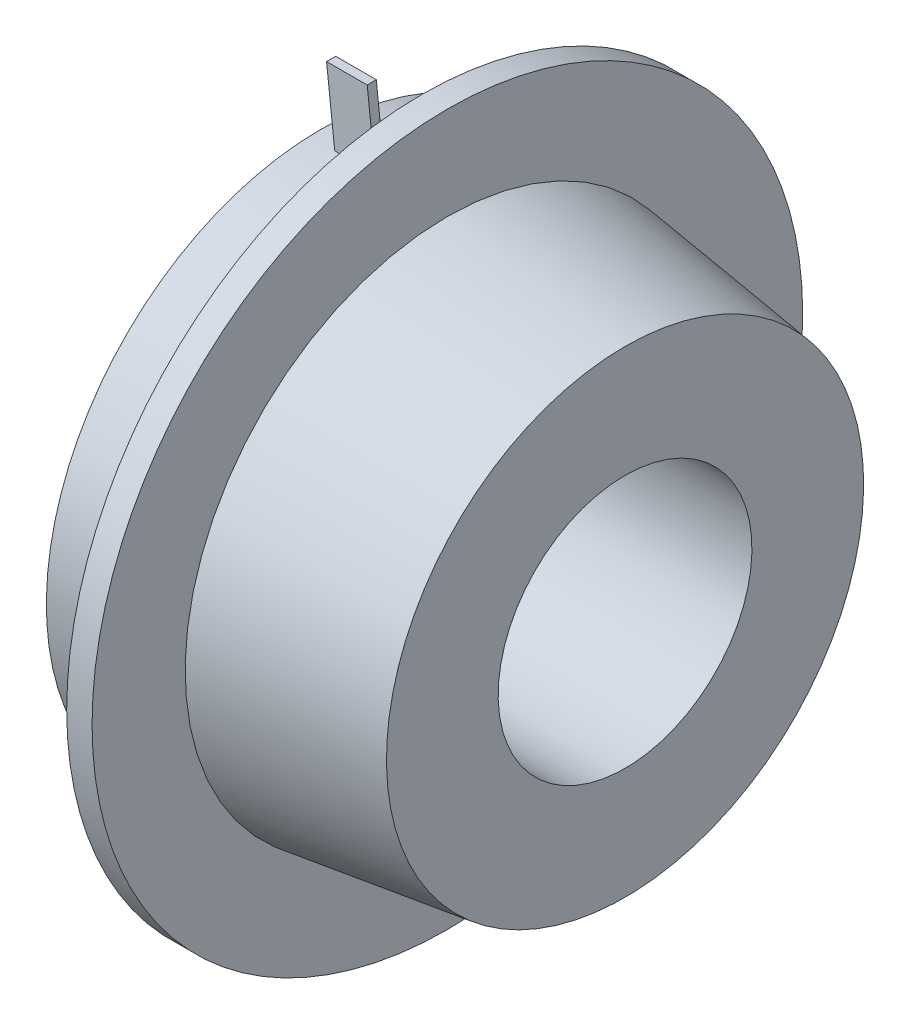
ISO-10303-21;
HEADER;
FILE_DESCRIPTION(('STEP AP214'),'2;1');
FILE_NAME('part.step','',(''),(''),'','','');
FILE_SCHEMA(('AUTOMOTIVE_DESIGN { 1 0 10303 214 1 1 1 1 }'));
ENDSEC;
DATA;
#1=APPLICATION_CONTEXT('core data for automotive mechanical design processes');
#2=APPLICATION_PROTOCOL_DEFINITION('international standard','automotive_design',2000,#1);
#3=PRODUCT_CONTEXT('',#1,'mechanical');
#4=PRODUCT('Part','Part','',(#3));
#5=PRODUCT_RELATED_PRODUCT_CATEGORY('part','',(#4));
#6=PRODUCT_DEFINITION_FORMATION('','',#4);
#7=PRODUCT_DEFINITION_CONTEXT('part definition',#1,'design');
#8=PRODUCT_DEFINITION('design','',#6,#7);
#9=PRODUCT_DEFINITION_SHAPE('','',#8);
#10=(LENGTH_UNIT() NAMED_UNIT(*) SI_UNIT(.MILLI.,.METRE.));
#11=(NAMED_UNIT(*) PLANE_ANGLE_UNIT() SI_UNIT($,.RADIAN.));
#12=(NAMED_UNIT(*) SI_UNIT($,.STERADIAN.) SOLID_ANGLE_UNIT());
#13=UNCERTAINTY_MEASURE_WITH_UNIT(LENGTH_MEASURE(1.E-05),#10,'distance_accuracy_value','');
#14=(GEOMETRIC_REPRESENTATION_CONTEXT(3) GLOBAL_UNCERTAINTY_ASSIGNED_CONTEXT((#13)) GLOBAL_UNIT_ASSIGNED_CONTEXT((#10,
#11,#12)) REPRESENTATION_CONTEXT('',''));
#15=CARTESIAN_POINT('',(0.,0.,0.));
#16=DIRECTION('',(0.,0.,1.));
#17=DIRECTION('',(1.,0.,0.));
#18=AXIS2_PLACEMENT_3D('',#15,#16,#17);
#19=CARTESIAN_POINT('',(0.,0.,0.));
#20=DIRECTION('',(-1.,0.,0.));
#21=DIRECTION('',(0.,0.,1.));
#22=AXIS2_PLACEMENT_3D('',#19,#20,#21);
#23=CYLINDRICAL_SURFACE('',#22,500.);
#24=CARTESIAN_POINT('',(1450.,0.,0.));
#25=DIRECTION('',(-1.,0.,0.));
#26=DIRECTION('',(0.,0.,1.));
#27=AXIS2_PLACEMENT_3D('',#24,#25,#26);
#28=CIRCLE('',#27,500.);
#29=CARTESIAN_POINT('',(1450.,500.,-3.58979302984161E-06));
#30=VERTEX_POINT('',#29);
#31=CARTESIAN_POINT('',(1450.,500.,0.));
#32=VERTEX_POINT('',#31);
#33=EDGE_CURVE('E12',#30,#32,#28,.T.);
#34=ORIENTED_EDGE('',*,*,#33,.T.);
#35=DIRECTION('',(1.,0.,0.));
#36=VECTOR('',#35,1.);
#37=CARTESIAN_POINT('',(1500.,500.,0.));
#38=LINE('',#37,#36);
#39=CARTESIAN_POINT('',(1500.,500.,0.));
#40=VERTEX_POINT('',#39);
#41=EDGE_CURVE('E108',#32,#40,#38,.T.);
#42=ORIENTED_EDGE('',*,*,#41,.T.);
#43=CARTESIAN_POINT('',(1500.,0.,0.));
#44=DIRECTION('',(-1.,0.,0.));
#45=DIRECTION('',(0.,0.,1.));
#46=AXIS2_PLACEMENT_3D('',#43,#44,#45);
#47=CIRCLE('',#46,500.);
#48=CARTESIAN_POINT('',(1500.,500.,-3.58979302984161E-06));
#49=VERTEX_POINT('',#48);
#50=EDGE_CURVE('E89',#49,#40,#47,.T.);
#51=ORIENTED_EDGE('',*,*,#50,.F.);
#52=DIRECTION('',(1.,0.,0.));
#53=VECTOR('',#52,1.);
#54=CARTESIAN_POINT('',(1500.,500.,-3.58979302984161E-06));
#55=LINE('',#54,#53);
#56=EDGE_CURVE('E117',#30,#49,#55,.T.);
#57=ORIENTED_EDGE('',*,*,#56,.F.);
#58=EDGE_LOOP('',(#34,#42,#51,#57));
#59=FACE_BOUND('',#58,.T.);
#60=ADVANCED_FACE('F49',(#59),#23,.F.);
#61=CARTESIAN_POINT('',(1450.,500.,-3.58979302984161E-06));
#62=DIRECTION('',(1.,0.,0.));
#63=DIRECTION('',(0.,0.,-1.));
#64=AXIS2_PLACEMENT_3D('',#61,#62,#63);
#65=PLANE('',#64);
#66=CARTESIAN_POINT('',(1450.,0.,0.));
#67=DIRECTION('',(-1.,0.,0.));
#68=DIRECTION('',(0.,0.,1.));
#69=AXIS2_PLACEMENT_3D('',#66,#67,#68);
#70=CIRCLE('',#69,700.);
#71=CARTESIAN_POINT('',(1450.,700.,-5.02571024177826E-06));
#72=VERTEX_POINT('',#71);
#73=CARTESIAN_POINT('',(1450.,700.,0.));
#74=VERTEX_POINT('',#73);
#75=EDGE_CURVE('E59',#72,#74,#70,.T.);
#76=ORIENTED_EDGE('',*,*,#75,.T.);
#77=DIRECTION('',(0.,-1.,0.));
#78=VECTOR('',#77,1.);
#79=CARTESIAN_POINT('',(1450.,500.,0.));
#80=LINE('',#79,#78);
#81=EDGE_CURVE('E114',#74,#32,#80,.T.);
#82=ORIENTED_EDGE('',*,*,#81,.T.);
#83=ORIENTED_EDGE('',*,*,#33,.F.);
#84=DIRECTION('',(0.,-1.,7.17958605968322E-09));
#85=VECTOR('',#84,1.);
#86=CARTESIAN_POINT('',(1450.,500.,-3.58979302984161E-06));
#87=LINE('',#86,#85);
#88=EDGE_CURVE('E105',#72,#30,#87,.T.);
#89=ORIENTED_EDGE('',*,*,#88,.F.);
#90=EDGE_LOOP('',(#76,#82,#83,#89));
#91=FACE_BOUND('',#90,.T.);
#92=ADVANCED_FACE('F55',(#91),#65,.F.);
#93=CARTESIAN_POINT('',(0.,0.,0.));
#94=DIRECTION('',(-1.,0.,0.));
#95=DIRECTION('',(0.,0.,1.));
#96=AXIS2_PLACEMENT_3D('',#93,#94,#95);
#97=CYLINDRICAL_SURFACE('',#96,700.);
#98=CARTESIAN_POINT('',(1500.,0.,0.));
#99=DIRECTION('',(-1.,0.,0.));
#100=DIRECTION('',(0.,0.,1.));
#101=AXIS2_PLACEMENT_3D('',#98,#99,#100);
#102=CIRCLE('',#101,700.);
#103=CARTESIAN_POINT('',(1500.,700.,-5.02571024177826E-06));
#104=VERTEX_POINT('',#103);
#105=CARTESIAN_POINT('',(1500.,700.,0.));
#106=VERTEX_POINT('',#105);
#107=EDGE_CURVE('E102',#104,#106,#102,.T.);
#108=ORIENTED_EDGE('',*,*,#107,.T.);
#109=DIRECTION('',(-1.,0.,0.));
#110=VECTOR('',#109,1.);
#111=CARTESIAN_POINT('',(1450.,700.,0.));
#112=LINE('',#111,#110);
#113=EDGE_CURVE('E109',#106,#74,#112,.T.);
#114=ORIENTED_EDGE('',*,*,#113,.T.);
#115=ORIENTED_EDGE('',*,*,#75,.F.);
#116=DIRECTION('',(-1.,0.,0.));
#117=VECTOR('',#116,1.);
#118=CARTESIAN_POINT('',(1450.,700.,-5.02571024177826E-06));
#119=LINE('',#118,#117);
#120=EDGE_CURVE('E119',#104,#72,#119,.T.);
#121=ORIENTED_EDGE('',*,*,#120,.F.);
#122=EDGE_LOOP('',(#108,#114,#115,#121));
#123=FACE_BOUND('',#122,.T.);
#124=ADVANCED_FACE('F122',(#123),#97,.T.);
#125=CARTESIAN_POINT('',(1500.,700.,-5.02571024177826E-06));
#126=DIRECTION('',(-1.,0.,0.));
#127=DIRECTION('',(0.,0.,1.));
#128=AXIS2_PLACEMENT_3D('',#125,#126,#127);
#129=PLANE('',#128);
#130=DIRECTION('',(0.,1.,-7.17958605968322E-09));
#131=VECTOR('',#130,1.);
#132=CARTESIAN_POINT('',(1500.,700.,-5.02571024177826E-06));
#133=LINE('',#132,#131);
#134=EDGE_CURVE('E96',#49,#104,#133,.T.);
#135=ORIENTED_EDGE('',*,*,#134,.F.);
#136=ORIENTED_EDGE('',*,*,#50,.T.);
#137=DIRECTION('',(0.,1.,0.));
#138=VECTOR('',#137,1.);
#139=CARTESIAN_POINT('',(1500.,700.,0.));
#140=LINE('',#139,#138);
#141=EDGE_CURVE('E93',#40,#106,#140,.T.);
#142=ORIENTED_EDGE('',*,*,#141,.T.);
#143=ORIENTED_EDGE('',*,*,#107,.F.);
#144=EDGE_LOOP('',(#135,#136,#142,#143));
#145=FACE_BOUND('',#144,.T.);
#146=ADVANCED_FACE('F95',(#145),#129,.F.);
#147=CARTESIAN_POINT('',(0.,0.,0.));
#148=DIRECTION('',(0.,-7.17958605968322E-09,-1.));
#149=DIRECTION('',(-1.,0.,0.));
#150=AXIS2_PLACEMENT_3D('',#147,#148,#149);
#151=PLANE('',#150);
#152=ORIENTED_EDGE('',*,*,#56,.T.);
#153=ORIENTED_EDGE('',*,*,#134,.T.);
#154=ORIENTED_EDGE('',*,*,#120,.T.);
#155=ORIENTED_EDGE('',*,*,#88,.T.);
#156=EDGE_LOOP('',(#152,#153,#154,#155));
#157=FACE_BOUND('',#156,.T.);
#158=ADVANCED_FACE('F125',(#157),#151,.F.);
#159=CARTESIAN_POINT('',(0.,0.,0.));
#160=DIRECTION('',(0.,0.,-1.));
#161=DIRECTION('',(-1.,0.,0.));
#162=AXIS2_PLACEMENT_3D('',#159,#160,#161);
#163=PLANE('',#162);
#164=ORIENTED_EDGE('',*,*,#41,.F.);
#165=ORIENTED_EDGE('',*,*,#81,.F.);
#166=ORIENTED_EDGE('',*,*,#113,.F.);
#167=ORIENTED_EDGE('',*,*,#141,.F.);
#168=EDGE_LOOP('',(#164,#165,#166,#167));
#169=FACE_BOUND('',#168,.T.);
#170=ADVANCED_FACE('F107',(#169),#163,.T.);
#171=CLOSED_SHELL('',(#60,#92,#124,#146,#158,#170));
#172=MANIFOLD_SOLID_BREP('B2',#171);
#173=CARTESIAN_POINT('',(1380.,500.,18.));
#174=DIRECTION('',(0.,1.,0.));
#175=DIRECTION('',(0.,0.,1.));
#176=AXIS2_PLACEMENT_3D('',#173,#174,#175);
#177=PLANE('',#176);
#178=DIRECTION('',(1.,0.,0.));
#179=VECTOR('',#178,1.);
#180=CARTESIAN_POINT('',(1380.,500.,0.));
#181=LINE('',#180,#179);
#182=CARTESIAN_POINT('',(1300.,500.,0.));
#183=VERTEX_POINT('',#182);
#184=CARTESIAN_POINT('',(1380.,500.,0.));
#185=VERTEX_POINT('',#184);
#186=EDGE_CURVE('E237',#183,#185,#181,.T.);
#187=ORIENTED_EDGE('',*,*,#186,.T.);
#188=DIRECTION('',(0.,0.,-1.));
#189=VECTOR('',#188,1.);
#190=CARTESIAN_POINT('',(1380.,500.,18.));
#191=LINE('',#190,#189);
#192=CARTESIAN_POINT('',(1380.,500.,18.));
#193=VERTEX_POINT('',#192);
#194=EDGE_CURVE('E48',#193,#185,#191,.T.);
#195=ORIENTED_EDGE('',*,*,#194,.F.);
#196=DIRECTION('',(1.,0.,0.));
#197=VECTOR('',#196,1.);
#198=CARTESIAN_POINT('',(1380.,500.,18.));
#199=LINE('',#198,#197);
#200=CARTESIAN_POINT('',(1300.,500.,18.));
#201=VERTEX_POINT('',#200);
#202=EDGE_CURVE('E222',#201,#193,#199,.T.);
#203=ORIENTED_EDGE('',*,*,#202,.F.);
#204=DIRECTION('',(0.,0.,-1.));
#205=VECTOR('',#204,1.);
#206=CARTESIAN_POINT('',(1300.,500.,18.));
#207=LINE('',#206,#205);
#208=EDGE_CURVE('E235',#201,#183,#207,.T.);
#209=ORIENTED_EDGE('',*,*,#208,.T.);
#210=EDGE_LOOP('',(#187,#195,#203,#209));
#211=FACE_BOUND('',#210,.T.);
#212=ADVANCED_FACE('F171',(#211),#177,.F.);
#213=CARTESIAN_POINT('',(1360.,680.,18.));
#214=DIRECTION('',(-0.993883734673619,-0.110431526074845,0.));
#215=DIRECTION('',(0.110431526074845,-0.993883734673619,0.));
#216=AXIS2_PLACEMENT_3D('',#213,#214,#215);
#217=PLANE('',#216);
#218=DIRECTION('',(-0.110431526074845,0.993883734673619,0.));
#219=VECTOR('',#218,1.);
#220=CARTESIAN_POINT('',(1360.,680.,0.));
#221=LINE('',#220,#219);
#222=CARTESIAN_POINT('',(1360.,680.,0.));
#223=VERTEX_POINT('',#222);
#224=EDGE_CURVE('E228',#185,#223,#221,.T.);
#225=ORIENTED_EDGE('',*,*,#224,.T.);
#226=DIRECTION('',(0.,0.,-1.));
#227=VECTOR('',#226,1.);
#228=CARTESIAN_POINT('',(1360.,680.,18.));
#229=LINE('',#228,#227);
#230=CARTESIAN_POINT('',(1360.,680.,18.));
#231=VERTEX_POINT('',#230);
#232=EDGE_CURVE('E181',#231,#223,#229,.T.);
#233=ORIENTED_EDGE('',*,*,#232,.F.);
#234=DIRECTION('',(-0.110431526074845,0.993883734673619,0.));
#235=VECTOR('',#234,1.);
#236=CARTESIAN_POINT('',(1360.,680.,18.));
#237=LINE('',#236,#235);
#238=EDGE_CURVE('E219',#193,#231,#237,.T.);
#239=ORIENTED_EDGE('',*,*,#238,.F.);
#240=ORIENTED_EDGE('',*,*,#194,.T.);
#241=EDGE_LOOP('',(#225,#233,#239,#240));
#242=FACE_BOUND('',#241,.T.);
#243=ADVANCED_FACE('F230',(#242),#217,.F.);
#244=CARTESIAN_POINT('',(1280.,680.,18.));
#245=DIRECTION('',(0.,-1.,0.));
#246=DIRECTION('',(0.,0.,-1.));
#247=AXIS2_PLACEMENT_3D('',#244,#245,#246);
#248=PLANE('',#247);
#249=DIRECTION('',(-1.,0.,0.));
#250=VECTOR('',#249,1.);
#251=CARTESIAN_POINT('',(1280.,680.,0.));
#252=LINE('',#251,#250);
#253=CARTESIAN_POINT('',(1280.,680.,0.));
#254=VERTEX_POINT('',#253);
#255=EDGE_CURVE('E207',#223,#254,#252,.T.);
#256=ORIENTED_EDGE('',*,*,#255,.T.);
#257=DIRECTION('',(0.,0.,-1.));
#258=VECTOR('',#257,1.);
#259=CARTESIAN_POINT('',(1280.,680.,18.));
#260=LINE('',#259,#258);
#261=CARTESIAN_POINT('',(1280.,680.,18.));
#262=VERTEX_POINT('',#261);
#263=EDGE_CURVE('E227',#262,#254,#260,.T.);
#264=ORIENTED_EDGE('',*,*,#263,.F.);
#265=DIRECTION('',(-1.,0.,0.));
#266=VECTOR('',#265,1.);
#267=CARTESIAN_POINT('',(1280.,680.,18.));
#268=LINE('',#267,#266);
#269=EDGE_CURVE('E225',#231,#262,#268,.T.);
#270=ORIENTED_EDGE('',*,*,#269,.F.);
#271=ORIENTED_EDGE('',*,*,#232,.T.);
#272=EDGE_LOOP('',(#256,#264,#270,#271));
#273=FACE_BOUND('',#272,.T.);
#274=ADVANCED_FACE('F229',(#273),#248,.F.);
#275=CARTESIAN_POINT('',(1300.,500.,18.));
#276=DIRECTION('',(0.993883734673619,0.110431526074847,0.));
#277=DIRECTION('',(-0.110431526074847,0.993883734673619,0.));
#278=AXIS2_PLACEMENT_3D('',#275,#276,#277);
#279=PLANE('',#278);
#280=DIRECTION('',(0.110431526074847,-0.993883734673619,0.));
#281=VECTOR('',#280,1.);
#282=CARTESIAN_POINT('',(1300.,500.,0.));
#283=LINE('',#282,#281);
#284=EDGE_CURVE('E212',#254,#183,#283,.T.);
#285=ORIENTED_EDGE('',*,*,#284,.T.);
#286=ORIENTED_EDGE('',*,*,#208,.F.);
#287=DIRECTION('',(0.110431526074847,-0.993883734673619,0.));
#288=VECTOR('',#287,1.);
#289=CARTESIAN_POINT('',(1300.,500.,18.));
#290=LINE('',#289,#288);
#291=EDGE_CURVE('E188',#262,#201,#290,.T.);
#292=ORIENTED_EDGE('',*,*,#291,.F.);
#293=ORIENTED_EDGE('',*,*,#263,.T.);
#294=EDGE_LOOP('',(#285,#286,#292,#293));
#295=FACE_BOUND('',#294,.T.);
#296=ADVANCED_FACE('F243',(#295),#279,.F.);
#297=CARTESIAN_POINT('',(0.,0.,18.));
#298=DIRECTION('',(0.,0.,-1.));
#299=DIRECTION('',(-1.,0.,0.));
#300=AXIS2_PLACEMENT_3D('',#297,#298,#299);
#301=PLANE('',#300);
#302=ORIENTED_EDGE('',*,*,#202,.T.);
#303=ORIENTED_EDGE('',*,*,#238,.T.);
#304=ORIENTED_EDGE('',*,*,#269,.T.);
#305=ORIENTED_EDGE('',*,*,#291,.T.);
#306=EDGE_LOOP('',(#302,#303,#304,#305));
#307=FACE_BOUND('',#306,.T.);
#308=ADVANCED_FACE('F217',(#307),#301,.F.);
#309=CARTESIAN_POINT('',(0.,0.,0.));
#310=DIRECTION('',(0.,0.,-1.));
#311=DIRECTION('',(-1.,0.,0.));
#312=AXIS2_PLACEMENT_3D('',#309,#310,#311);
#313=PLANE('',#312);
#314=ORIENTED_EDGE('',*,*,#186,.F.);
#315=ORIENTED_EDGE('',*,*,#284,.F.);
#316=ORIENTED_EDGE('',*,*,#255,.F.);
#317=ORIENTED_EDGE('',*,*,#224,.F.);
#318=EDGE_LOOP('',(#314,#315,#316,#317));
#319=FACE_BOUND('',#318,.T.);
#320=ADVANCED_FACE('F247',(#319),#313,.T.);
#321=CLOSED_SHELL('',(#212,#243,#274,#296,#308,#320));
#322=MANIFOLD_SOLID_BREP('B6',#321);
#323=CARTESIAN_POINT('',(0.,0.,0.));
#324=DIRECTION('',(-1.,0.,0.));
#325=DIRECTION('',(0.,0.,1.));
#326=AXIS2_PLACEMENT_3D('',#323,#324,#325);
#327=CYLINDRICAL_SURFACE('',#326,250.);
#328=CARTESIAN_POINT('',(1250.,0.,0.));
#329=DIRECTION('',(-1.,0.,0.));
#330=DIRECTION('',(0.,0.,1.));
#331=AXIS2_PLACEMENT_3D('',#328,#329,#330);
#332=CIRCLE('',#331,250.);
#333=CARTESIAN_POINT('',(1250.,250.,-1.79489651492081E-06));
#334=VERTEX_POINT('',#333);
#335=CARTESIAN_POINT('',(1250.,250.,0.));
#336=VERTEX_POINT('',#335);
#337=EDGE_CURVE('E173',#334,#336,#332,.T.);
#338=ORIENTED_EDGE('',*,*,#337,.T.);
#339=DIRECTION('',(1.,0.,0.));
#340=VECTOR('',#339,1.);
#341=CARTESIAN_POINT('',(1850.,250.,0.));
#342=LINE('',#341,#340);
#343=CARTESIAN_POINT('',(1850.,250.,0.));
#344=VERTEX_POINT('',#343);
#345=EDGE_CURVE('E361',#336,#344,#342,.T.);
#346=ORIENTED_EDGE('',*,*,#345,.T.);
#347=CARTESIAN_POINT('',(1850.,0.,0.));
#348=DIRECTION('',(-1.,0.,0.));
#349=DIRECTION('',(0.,0.,1.));
#350=AXIS2_PLACEMENT_3D('',#347,#348,#349);
#351=CIRCLE('',#350,250.);
#352=CARTESIAN_POINT('',(1850.,250.,-1.79489651492081E-06));
#353=VERTEX_POINT('',#352);
#354=EDGE_CURVE('E343',#353,#344,#351,.T.);
#355=ORIENTED_EDGE('',*,*,#354,.F.);
#356=DIRECTION('',(1.,0.,0.));
#357=VECTOR('',#356,1.);
#358=CARTESIAN_POINT('',(1850.,250.,-1.79489651492081E-06));
#359=LINE('',#358,#357);
#360=EDGE_CURVE('E375',#334,#353,#359,.T.);
#361=ORIENTED_EDGE('',*,*,#360,.F.);
#362=EDGE_LOOP('',(#338,#346,#355,#361));
#363=FACE_BOUND('',#362,.T.);
#364=ADVANCED_FACE('F300',(#363),#327,.F.);
#365=CARTESIAN_POINT('',(1250.,250.,-1.79489651492081E-06));
#366=DIRECTION('',(1.,0.,0.));
#367=DIRECTION('',(0.,0.,-1.));
#368=AXIS2_PLACEMENT_3D('',#365,#366,#367);
#369=PLANE('',#368);
#370=CARTESIAN_POINT('',(1250.,0.,0.));
#371=DIRECTION('',(-1.,0.,0.));
#372=DIRECTION('',(0.,0.,1.));
#373=AXIS2_PLACEMENT_3D('',#370,#371,#372);
#374=CIRCLE('',#373,540.);
#375=CARTESIAN_POINT('',(1250.,540.,-3.87697647222894E-06));
#376=VERTEX_POINT('',#375);
#377=CARTESIAN_POINT('',(1250.,540.,0.));
#378=VERTEX_POINT('',#377);
#379=EDGE_CURVE('E304',#376,#378,#374,.T.);
#380=ORIENTED_EDGE('',*,*,#379,.T.);
#381=DIRECTION('',(0.,-1.,0.));
#382=VECTOR('',#381,1.);
#383=CARTESIAN_POINT('',(1250.,250.,0.));
#384=LINE('',#383,#382);
#385=EDGE_CURVE('E369',#378,#336,#384,.T.);
#386=ORIENTED_EDGE('',*,*,#385,.T.);
#387=ORIENTED_EDGE('',*,*,#337,.F.);
#388=DIRECTION('',(0.,-1.,7.17958605968322E-09));
#389=VECTOR('',#388,1.);
#390=CARTESIAN_POINT('',(1250.,250.,-1.79489651492081E-06));
#391=LINE('',#390,#389);
#392=EDGE_CURVE('E352',#376,#334,#391,.T.);
#393=ORIENTED_EDGE('',*,*,#392,.F.);
#394=EDGE_LOOP('',(#380,#386,#387,#393));
#395=FACE_BOUND('',#394,.T.);
#396=ADVANCED_FACE('F299',(#395),#369,.F.);
#397=CARTESIAN_POINT('',(1400.,0.,0.));
#398=DIRECTION('',(-1.,0.,0.));
#399=DIRECTION('',(0.,0.,1.));
#400=AXIS2_PLACEMENT_3D('',#397,#398,#399);
#401=CONICAL_SURFACE('',#400,530.,0.0665681637758239);
#402=CARTESIAN_POINT('',(1400.,0.,0.));
#403=DIRECTION('',(-1.,0.,0.));
#404=DIRECTION('',(0.,0.,1.));
#405=AXIS2_PLACEMENT_3D('',#402,#403,#404);
#406=CIRCLE('',#405,530.);
#407=CARTESIAN_POINT('',(1400.,530.,-3.80518061163211E-06));
#408=VERTEX_POINT('',#407);
#409=CARTESIAN_POINT('',(1400.,530.,0.));
#410=VERTEX_POINT('',#409);
#411=EDGE_CURVE('E382',#408,#410,#406,.T.);
#412=ORIENTED_EDGE('',*,*,#411,.T.);
#413=DIRECTION('',(-0.997785157856609,0.066519010523774,0.));
#414=VECTOR('',#413,1.);
#415=CARTESIAN_POINT('',(1250.,540.,0.));
#416=LINE('',#415,#414);
#417=EDGE_CURVE('E367',#410,#378,#416,.T.);
#418=ORIENTED_EDGE('',*,*,#417,.T.);
#419=ORIENTED_EDGE('',*,*,#379,.F.);
#420=DIRECTION('',(-0.997785157856609,0.066519010523774,-4.7757896066041E-10));
#421=VECTOR('',#420,1.);
#422=CARTESIAN_POINT('',(1250.,540.,-3.87697647222894E-06));
#423=LINE('',#422,#421);
#424=EDGE_CURVE('E380',#408,#376,#423,.T.);
#425=ORIENTED_EDGE('',*,*,#424,.F.);
#426=EDGE_LOOP('',(#412,#418,#419,#425));
#427=FACE_BOUND('',#426,.T.);
#428=ADVANCED_FACE('F381',(#427),#401,.T.);
#429=CARTESIAN_POINT('',(1850.,0.,0.));
#430=DIRECTION('',(-1.,0.,0.));
#431=DIRECTION('',(0.,0.,1.));
#432=AXIS2_PLACEMENT_3D('',#429,#430,#431);
#433=CONICAL_SURFACE('',#432,470.,0.132551532296674);
#434=CARTESIAN_POINT('',(1850.,0.,0.));
#435=DIRECTION('',(-1.,0.,0.));
#436=DIRECTION('',(0.,0.,1.));
#437=AXIS2_PLACEMENT_3D('',#434,#435,#436);
#438=CIRCLE('',#437,470.);
#439=CARTESIAN_POINT('',(1850.,470.,-3.37440544805111E-06));
#440=VERTEX_POINT('',#439);
#441=CARTESIAN_POINT('',(1850.,470.,0.));
#442=VERTEX_POINT('',#441);
#443=EDGE_CURVE('E354',#440,#442,#438,.T.);
#444=ORIENTED_EDGE('',*,*,#443,.T.);
#445=DIRECTION('',(-0.991227900682635,0.132163720091018,0.));
#446=VECTOR('',#445,1.);
#447=CARTESIAN_POINT('',(1700.,490.,0.));
#448=LINE('',#447,#446);
#449=EDGE_CURVE('E363',#442,#410,#448,.T.);
#450=ORIENTED_EDGE('',*,*,#449,.T.);
#451=ORIENTED_EDGE('',*,*,#411,.F.);
#452=DIRECTION('',(-0.991227900682635,0.132163720091018,-9.48880802361348E-10));
#453=VECTOR('',#452,1.);
#454=CARTESIAN_POINT('',(1700.,490.,-3.51799716924478E-06));
#455=LINE('',#454,#453);
#456=EDGE_CURVE('E373',#440,#408,#455,.T.);
#457=ORIENTED_EDGE('',*,*,#456,.F.);
#458=EDGE_LOOP('',(#444,#450,#451,#457));
#459=FACE_BOUND('',#458,.T.);
#460=ADVANCED_FACE('F390',(#459),#433,.T.);
#461=CARTESIAN_POINT('',(1850.,470.,-3.37440544805111E-06));
#462=DIRECTION('',(-1.,0.,0.));
#463=DIRECTION('',(0.,0.,1.));
#464=AXIS2_PLACEMENT_3D('',#461,#462,#463);
#465=PLANE('',#464);
#466=DIRECTION('',(0.,1.,-7.17958605968322E-09));
#467=VECTOR('',#466,1.);
#468=CARTESIAN_POINT('',(1850.,470.,-3.37440544805111E-06));
#469=LINE('',#468,#467);
#470=EDGE_CURVE('E350',#353,#440,#469,.T.);
#471=ORIENTED_EDGE('',*,*,#470,.F.);
#472=ORIENTED_EDGE('',*,*,#354,.T.);
#473=DIRECTION('',(0.,1.,0.));
#474=VECTOR('',#473,1.);
#475=CARTESIAN_POINT('',(1850.,470.,0.));
#476=LINE('',#475,#474);
#477=EDGE_CURVE('E348',#344,#442,#476,.T.);
#478=ORIENTED_EDGE('',*,*,#477,.T.);
#479=ORIENTED_EDGE('',*,*,#443,.F.);
#480=EDGE_LOOP('',(#471,#472,#478,#479));
#481=FACE_BOUND('',#480,.T.);
#482=ADVANCED_FACE('F341',(#481),#465,.F.);
#483=CARTESIAN_POINT('',(0.,0.,0.));
#484=DIRECTION('',(0.,-7.17958605968322E-09,-1.));
#485=DIRECTION('',(-1.,0.,0.));
#486=AXIS2_PLACEMENT_3D('',#483,#484,#485);
#487=PLANE('',#486);
#488=ORIENTED_EDGE('',*,*,#360,.T.);
#489=ORIENTED_EDGE('',*,*,#470,.T.);
#490=ORIENTED_EDGE('',*,*,#456,.T.);
#491=ORIENTED_EDGE('',*,*,#424,.T.);
#492=ORIENTED_EDGE('',*,*,#392,.T.);
#493=EDGE_LOOP('',(#488,#489,#490,#491,#492));
#494=FACE_BOUND('',#493,.T.);
#495=ADVANCED_FACE('F389',(#494),#487,.F.);
#496=CARTESIAN_POINT('',(0.,0.,0.));
#497=DIRECTION('',(0.,0.,-1.));
#498=DIRECTION('',(-1.,0.,0.));
#499=AXIS2_PLACEMENT_3D('',#496,#497,#498);
#500=PLANE('',#499);
#501=ORIENTED_EDGE('',*,*,#345,.F.);
#502=ORIENTED_EDGE('',*,*,#385,.F.);
#503=ORIENTED_EDGE('',*,*,#417,.F.);
#504=ORIENTED_EDGE('',*,*,#449,.F.);
#505=ORIENTED_EDGE('',*,*,#477,.F.);
#506=EDGE_LOOP('',(#501,#502,#503,#504,#505));
#507=FACE_BOUND('',#506,.T.);
#508=ADVANCED_FACE('F357',(#507),#500,.T.);
#509=CLOSED_SHELL('',(#364,#396,#428,#460,#482,#495,#508));
#510=MANIFOLD_SOLID_BREP('B45',#509);
#511=ADVANCED_BREP_SHAPE_REPRESENTATION('',(#18,#172,#322,#510),#14);
#512=SHAPE_DEFINITION_REPRESENTATION(#9,#511);
ENDSEC;
END-ISO-10303-21;
